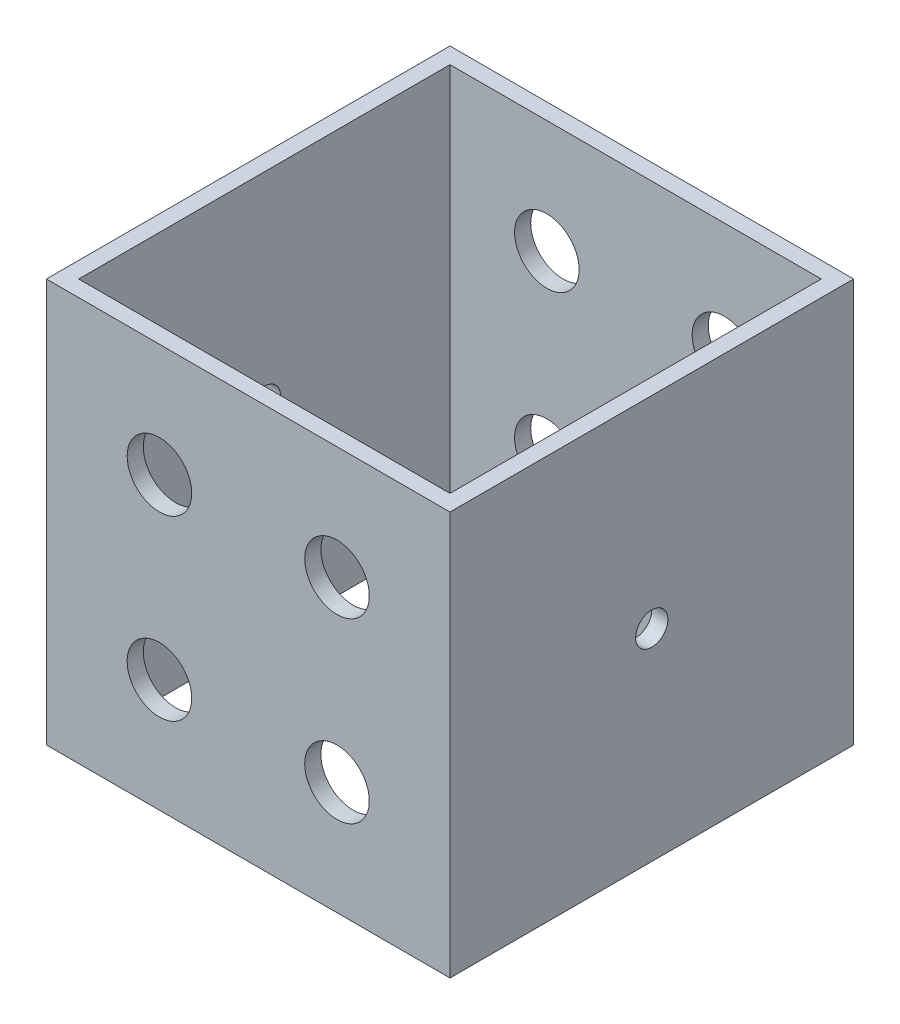
ISO-10303-21;
HEADER;
FILE_DESCRIPTION(('STEP AP214'),'2;1');
FILE_NAME('part.step','',(''),(''),'','','');
FILE_SCHEMA(('AUTOMOTIVE_DESIGN { 1 0 10303 214 1 1 1 1 }'));
ENDSEC;
DATA;
#1=APPLICATION_CONTEXT('core data for automotive mechanical design processes');
#2=APPLICATION_PROTOCOL_DEFINITION('international standard','automotive_design',2000,#1);
#3=PRODUCT_CONTEXT('',#1,'mechanical');
#4=PRODUCT('Part','Part','',(#3));
#5=PRODUCT_RELATED_PRODUCT_CATEGORY('part','',(#4));
#6=PRODUCT_DEFINITION_FORMATION('','',#4);
#7=PRODUCT_DEFINITION_CONTEXT('part definition',#1,'design');
#8=PRODUCT_DEFINITION('design','',#6,#7);
#9=PRODUCT_DEFINITION_SHAPE('','',#8);
#10=(LENGTH_UNIT() NAMED_UNIT(*) SI_UNIT(.MILLI.,.METRE.));
#11=(NAMED_UNIT(*) PLANE_ANGLE_UNIT() SI_UNIT($,.RADIAN.));
#12=(NAMED_UNIT(*) SI_UNIT($,.STERADIAN.) SOLID_ANGLE_UNIT());
#13=UNCERTAINTY_MEASURE_WITH_UNIT(LENGTH_MEASURE(1.E-05),#10,'distance_accuracy_value','');
#14=(GEOMETRIC_REPRESENTATION_CONTEXT(3) GLOBAL_UNCERTAINTY_ASSIGNED_CONTEXT((#13)) GLOBAL_UNIT_ASSIGNED_CONTEXT((#10,
#11,#12)) REPRESENTATION_CONTEXT('',''));
#15=CARTESIAN_POINT('',(0.,0.,0.));
#16=DIRECTION('',(0.,0.,1.));
#17=DIRECTION('',(1.,0.,0.));
#18=AXIS2_PLACEMENT_3D('',#15,#16,#17);
#19=CARTESIAN_POINT('',(12.5,-12.5,-12.5));
#20=DIRECTION('',(1.,0.,0.));
#21=DIRECTION('',(0.,0.,-1.));
#22=AXIS2_PLACEMENT_3D('',#19,#20,#21);
#23=PLANE('',#22);
#24=CARTESIAN_POINT('',(12.5,0.,0.));
#25=DIRECTION('',(1.,0.,0.));
#26=DIRECTION('',(0.,0.,-1.));
#27=AXIS2_PLACEMENT_3D('',#24,#25,#26);
#28=CIRCLE('',#27,1.);
#29=CARTESIAN_POINT('',(12.5,0.,-1.));
#30=VERTEX_POINT('',#29);
#31=EDGE_CURVE('E220',#30,#30,#28,.T.);
#32=ORIENTED_EDGE('',*,*,#31,.F.);
#33=EDGE_LOOP('',(#32));
#34=FACE_BOUND('',#33,.T.);
#35=DIRECTION('',(0.,1.,0.));
#36=VECTOR('',#35,1.);
#37=CARTESIAN_POINT('',(12.5,-12.5,-12.5));
#38=LINE('',#37,#36);
#39=CARTESIAN_POINT('',(12.5,-12.5,-12.5));
#40=VERTEX_POINT('',#39);
#41=CARTESIAN_POINT('',(12.5,12.5,-12.5));
#42=VERTEX_POINT('',#41);
#43=EDGE_CURVE('E162',#40,#42,#38,.T.);
#44=ORIENTED_EDGE('',*,*,#43,.T.);
#45=DIRECTION('',(0.,0.,-1.));
#46=VECTOR('',#45,1.);
#47=CARTESIAN_POINT('',(12.5,12.5,-12.5));
#48=LINE('',#47,#46);
#49=CARTESIAN_POINT('',(12.5,12.5,12.5));
#50=VERTEX_POINT('',#49);
#51=EDGE_CURVE('E130',#50,#42,#48,.T.);
#52=ORIENTED_EDGE('',*,*,#51,.F.);
#53=DIRECTION('',(0.,1.,0.));
#54=VECTOR('',#53,1.);
#55=CARTESIAN_POINT('',(12.5,-12.5,12.5));
#56=LINE('',#55,#54);
#57=CARTESIAN_POINT('',(12.5,-12.5,12.5));
#58=VERTEX_POINT('',#57);
#59=EDGE_CURVE('E11',#58,#50,#56,.T.);
#60=ORIENTED_EDGE('',*,*,#59,.F.);
#61=DIRECTION('',(0.,0.,-1.));
#62=VECTOR('',#61,1.);
#63=CARTESIAN_POINT('',(12.5,-12.5,-12.5));
#64=LINE('',#63,#62);
#65=EDGE_CURVE('E149',#58,#40,#64,.T.);
#66=ORIENTED_EDGE('',*,*,#65,.T.);
#67=EDGE_LOOP('',(#44,#52,#60,#66));
#68=FACE_BOUND('',#67,.T.);
#69=ADVANCED_FACE('F33',(#34,#68),#23,.T.);
#70=CARTESIAN_POINT('',(-12.5,-12.5,12.5));
#71=DIRECTION('',(0.,0.,1.));
#72=DIRECTION('',(1.,0.,0.));
#73=AXIS2_PLACEMENT_3D('',#70,#71,#72);
#74=PLANE('',#73);
#75=CARTESIAN_POINT('',(5.49999999999999,5.5,12.5));
#76=DIRECTION('',(0.,0.,-1.));
#77=DIRECTION('',(-1.,0.,0.));
#78=AXIS2_PLACEMENT_3D('',#75,#76,#77);
#79=CIRCLE('',#78,2.);
#80=CARTESIAN_POINT('',(3.49999999999999,5.5,12.5));
#81=VERTEX_POINT('',#80);
#82=EDGE_CURVE('E203',#81,#81,#79,.T.);
#83=ORIENTED_EDGE('',*,*,#82,.T.);
#84=EDGE_LOOP('',(#83));
#85=FACE_BOUND('',#84,.T.);
#86=CARTESIAN_POINT('',(5.49999999999999,-5.5,12.5));
#87=DIRECTION('',(0.,0.,-1.));
#88=DIRECTION('',(-1.,0.,0.));
#89=AXIS2_PLACEMENT_3D('',#86,#87,#88);
#90=CIRCLE('',#89,2.);
#91=CARTESIAN_POINT('',(3.49999999999999,-5.5,12.5));
#92=VERTEX_POINT('',#91);
#93=EDGE_CURVE('E210',#92,#92,#90,.T.);
#94=ORIENTED_EDGE('',*,*,#93,.T.);
#95=EDGE_LOOP('',(#94));
#96=FACE_BOUND('',#95,.T.);
#97=CARTESIAN_POINT('',(-5.50000000000001,-5.5,12.5));
#98=DIRECTION('',(0.,0.,-1.));
#99=DIRECTION('',(-1.,0.,0.));
#100=AXIS2_PLACEMENT_3D('',#97,#98,#99);
#101=CIRCLE('',#100,2.);
#102=CARTESIAN_POINT('',(-7.50000000000001,-5.5,12.5));
#103=VERTEX_POINT('',#102);
#104=EDGE_CURVE('E197',#103,#103,#101,.T.);
#105=ORIENTED_EDGE('',*,*,#104,.T.);
#106=EDGE_LOOP('',(#105));
#107=FACE_BOUND('',#106,.T.);
#108=CARTESIAN_POINT('',(-5.50000000000001,5.5,12.5));
#109=DIRECTION('',(0.,0.,-1.));
#110=DIRECTION('',(-1.,0.,0.));
#111=AXIS2_PLACEMENT_3D('',#108,#109,#110);
#112=CIRCLE('',#111,2.);
#113=CARTESIAN_POINT('',(-7.50000000000001,5.5,12.5));
#114=VERTEX_POINT('',#113);
#115=EDGE_CURVE('E172',#114,#114,#112,.T.);
#116=ORIENTED_EDGE('',*,*,#115,.T.);
#117=EDGE_LOOP('',(#116));
#118=FACE_BOUND('',#117,.T.);
#119=ORIENTED_EDGE('',*,*,#59,.T.);
#120=DIRECTION('',(1.,0.,0.));
#121=VECTOR('',#120,1.);
#122=CARTESIAN_POINT('',(-12.5,12.5,12.5));
#123=LINE('',#122,#121);
#124=CARTESIAN_POINT('',(-12.5,12.5,12.5));
#125=VERTEX_POINT('',#124);
#126=EDGE_CURVE('E139',#125,#50,#123,.T.);
#127=ORIENTED_EDGE('',*,*,#126,.F.);
#128=DIRECTION('',(0.,1.,0.));
#129=VECTOR('',#128,1.);
#130=CARTESIAN_POINT('',(-12.5,-12.5,12.5));
#131=LINE('',#130,#129);
#132=CARTESIAN_POINT('',(-12.5,-12.5,12.5));
#133=VERTEX_POINT('',#132);
#134=EDGE_CURVE('E41',#133,#125,#131,.T.);
#135=ORIENTED_EDGE('',*,*,#134,.F.);
#136=DIRECTION('',(1.,0.,0.));
#137=VECTOR('',#136,1.);
#138=CARTESIAN_POINT('',(-12.5,-12.5,12.5));
#139=LINE('',#138,#137);
#140=EDGE_CURVE('E160',#133,#58,#139,.T.);
#141=ORIENTED_EDGE('',*,*,#140,.T.);
#142=EDGE_LOOP('',(#119,#127,#135,#141));
#143=FACE_BOUND('',#142,.T.);
#144=ADVANCED_FACE('F249',(#85,#96,#107,#118,#143),#74,.T.);
#145=CARTESIAN_POINT('',(-12.5,-12.5,-12.5));
#146=DIRECTION('',(-1.,0.,0.));
#147=DIRECTION('',(0.,0.,1.));
#148=AXIS2_PLACEMENT_3D('',#145,#146,#147);
#149=PLANE('',#148);
#150=CARTESIAN_POINT('',(-12.5,0.,0.));
#151=DIRECTION('',(1.,0.,0.));
#152=DIRECTION('',(0.,0.,-1.));
#153=AXIS2_PLACEMENT_3D('',#150,#151,#152);
#154=CIRCLE('',#153,1.);
#155=CARTESIAN_POINT('',(-12.5,0.,-0.999999999999998));
#156=VERTEX_POINT('',#155);
#157=EDGE_CURVE('E223',#156,#156,#154,.T.);
#158=ORIENTED_EDGE('',*,*,#157,.T.);
#159=EDGE_LOOP('',(#158));
#160=FACE_BOUND('',#159,.T.);
#161=ORIENTED_EDGE('',*,*,#134,.T.);
#162=DIRECTION('',(0.,0.,1.));
#163=VECTOR('',#162,1.);
#164=CARTESIAN_POINT('',(-12.5,12.5,-12.5));
#165=LINE('',#164,#163);
#166=CARTESIAN_POINT('',(-12.5,12.5,-12.5));
#167=VERTEX_POINT('',#166);
#168=EDGE_CURVE('E136',#167,#125,#165,.T.);
#169=ORIENTED_EDGE('',*,*,#168,.F.);
#170=DIRECTION('',(0.,1.,0.));
#171=VECTOR('',#170,1.);
#172=CARTESIAN_POINT('',(-12.5,-12.5,-12.5));
#173=LINE('',#172,#171);
#174=CARTESIAN_POINT('',(-12.5,-12.5,-12.5));
#175=VERTEX_POINT('',#174);
#176=EDGE_CURVE('E165',#175,#167,#173,.T.);
#177=ORIENTED_EDGE('',*,*,#176,.F.);
#178=DIRECTION('',(0.,0.,1.));
#179=VECTOR('',#178,1.);
#180=CARTESIAN_POINT('',(-12.5,-12.5,-12.5));
#181=LINE('',#180,#179);
#182=EDGE_CURVE('E157',#175,#133,#181,.T.);
#183=ORIENTED_EDGE('',*,*,#182,.T.);
#184=EDGE_LOOP('',(#161,#169,#177,#183));
#185=FACE_BOUND('',#184,.T.);
#186=ADVANCED_FACE('F254',(#160,#185),#149,.T.);
#187=CARTESIAN_POINT('',(-12.5,-12.5,-12.5));
#188=DIRECTION('',(0.,0.,-1.));
#189=DIRECTION('',(-1.,0.,0.));
#190=AXIS2_PLACEMENT_3D('',#187,#188,#189);
#191=PLANE('',#190);
#192=CARTESIAN_POINT('',(5.49999999999999,5.5,-12.5));
#193=DIRECTION('',(0.,0.,-1.));
#194=DIRECTION('',(-1.,0.,0.));
#195=AXIS2_PLACEMENT_3D('',#192,#193,#194);
#196=CIRCLE('',#195,2.);
#197=CARTESIAN_POINT('',(3.49999999999999,5.5,-12.5));
#198=VERTEX_POINT('',#197);
#199=EDGE_CURVE('E200',#198,#198,#196,.T.);
#200=ORIENTED_EDGE('',*,*,#199,.F.);
#201=EDGE_LOOP('',(#200));
#202=FACE_BOUND('',#201,.T.);
#203=CARTESIAN_POINT('',(5.49999999999999,-5.5,-12.5));
#204=DIRECTION('',(0.,0.,-1.));
#205=DIRECTION('',(-1.,0.,0.));
#206=AXIS2_PLACEMENT_3D('',#203,#204,#205);
#207=CIRCLE('',#206,2.);
#208=CARTESIAN_POINT('',(3.49999999999999,-5.5,-12.5));
#209=VERTEX_POINT('',#208);
#210=EDGE_CURVE('E207',#209,#209,#207,.T.);
#211=ORIENTED_EDGE('',*,*,#210,.F.);
#212=EDGE_LOOP('',(#211));
#213=FACE_BOUND('',#212,.T.);
#214=CARTESIAN_POINT('',(-5.50000000000001,-5.5,-12.5));
#215=DIRECTION('',(0.,0.,-1.));
#216=DIRECTION('',(-1.,0.,0.));
#217=AXIS2_PLACEMENT_3D('',#214,#215,#216);
#218=CIRCLE('',#217,2.);
#219=CARTESIAN_POINT('',(-7.50000000000001,-5.5,-12.5));
#220=VERTEX_POINT('',#219);
#221=EDGE_CURVE('E213',#220,#220,#218,.T.);
#222=ORIENTED_EDGE('',*,*,#221,.F.);
#223=EDGE_LOOP('',(#222));
#224=FACE_BOUND('',#223,.T.);
#225=CARTESIAN_POINT('',(-5.50000000000001,5.5,-12.5));
#226=DIRECTION('',(0.,0.,-1.));
#227=DIRECTION('',(-1.,0.,0.));
#228=AXIS2_PLACEMENT_3D('',#225,#226,#227);
#229=CIRCLE('',#228,2.);
#230=CARTESIAN_POINT('',(-7.50000000000001,5.5,-12.5));
#231=VERTEX_POINT('',#230);
#232=EDGE_CURVE('E194',#231,#231,#229,.T.);
#233=ORIENTED_EDGE('',*,*,#232,.F.);
#234=EDGE_LOOP('',(#233));
#235=FACE_BOUND('',#234,.T.);
#236=ORIENTED_EDGE('',*,*,#176,.T.);
#237=DIRECTION('',(-1.,0.,0.));
#238=VECTOR('',#237,1.);
#239=CARTESIAN_POINT('',(-12.5,12.5,-12.5));
#240=LINE('',#239,#238);
#241=EDGE_CURVE('E133',#42,#167,#240,.T.);
#242=ORIENTED_EDGE('',*,*,#241,.F.);
#243=ORIENTED_EDGE('',*,*,#43,.F.);
#244=DIRECTION('',(-1.,0.,0.));
#245=VECTOR('',#244,1.);
#246=CARTESIAN_POINT('',(-12.5,-12.5,-12.5));
#247=LINE('',#246,#245);
#248=EDGE_CURVE('E154',#40,#175,#247,.T.);
#249=ORIENTED_EDGE('',*,*,#248,.T.);
#250=EDGE_LOOP('',(#236,#242,#243,#249));
#251=FACE_BOUND('',#250,.T.);
#252=ADVANCED_FACE('F261',(#202,#213,#224,#235,#251),#191,.T.);
#253=CARTESIAN_POINT('',(0.,-12.5,0.));
#254=DIRECTION('',(0.,1.,0.));
#255=DIRECTION('',(0.,0.,1.));
#256=AXIS2_PLACEMENT_3D('',#253,#254,#255);
#257=PLANE('',#256);
#258=DIRECTION('',(1.,0.,0.));
#259=VECTOR('',#258,1.);
#260=CARTESIAN_POINT('',(-11.5,-12.5,11.5));
#261=LINE('',#260,#259);
#262=CARTESIAN_POINT('',(-11.5,-12.5,11.5));
#263=VERTEX_POINT('',#262);
#264=CARTESIAN_POINT('',(11.5,-12.5,11.5));
#265=VERTEX_POINT('',#264);
#266=EDGE_CURVE('E110',#263,#265,#261,.T.);
#267=ORIENTED_EDGE('',*,*,#266,.T.);
#268=DIRECTION('',(0.,0.,-1.));
#269=VECTOR('',#268,1.);
#270=CARTESIAN_POINT('',(11.5,-12.5,-11.5));
#271=LINE('',#270,#269);
#272=CARTESIAN_POINT('',(11.5,-12.5,-11.5));
#273=VERTEX_POINT('',#272);
#274=EDGE_CURVE('E142',#265,#273,#271,.T.);
#275=ORIENTED_EDGE('',*,*,#274,.T.);
#276=DIRECTION('',(-1.,0.,0.));
#277=VECTOR('',#276,1.);
#278=CARTESIAN_POINT('',(-11.5,-12.5,-11.5));
#279=LINE('',#278,#277);
#280=CARTESIAN_POINT('',(-11.5,-12.5,-11.5));
#281=VERTEX_POINT('',#280);
#282=EDGE_CURVE('E105',#273,#281,#279,.T.);
#283=ORIENTED_EDGE('',*,*,#282,.T.);
#284=DIRECTION('',(0.,0.,1.));
#285=VECTOR('',#284,1.);
#286=CARTESIAN_POINT('',(-11.5,-12.5,-11.5));
#287=LINE('',#286,#285);
#288=EDGE_CURVE('E49',#281,#263,#287,.T.);
#289=ORIENTED_EDGE('',*,*,#288,.T.);
#290=EDGE_LOOP('',(#267,#275,#283,#289));
#291=FACE_BOUND('',#290,.T.);
#292=ORIENTED_EDGE('',*,*,#65,.F.);
#293=ORIENTED_EDGE('',*,*,#140,.F.);
#294=ORIENTED_EDGE('',*,*,#182,.F.);
#295=ORIENTED_EDGE('',*,*,#248,.F.);
#296=EDGE_LOOP('',(#292,#293,#294,#295));
#297=FACE_BOUND('',#296,.T.);
#298=ADVANCED_FACE('F269',(#291,#297),#257,.F.);
#299=CARTESIAN_POINT('',(11.5,-12.5,-11.5));
#300=DIRECTION('',(1.,0.,0.));
#301=DIRECTION('',(0.,0.,-1.));
#302=AXIS2_PLACEMENT_3D('',#299,#300,#301);
#303=PLANE('',#302);
#304=CARTESIAN_POINT('',(11.5,0.,0.));
#305=DIRECTION('',(1.,0.,0.));
#306=DIRECTION('',(0.,0.,-1.));
#307=AXIS2_PLACEMENT_3D('',#304,#305,#306);
#308=CIRCLE('',#307,1.);
#309=CARTESIAN_POINT('',(11.5,0.,-1.));
#310=VERTEX_POINT('',#309);
#311=EDGE_CURVE('E204',#310,#310,#308,.T.);
#312=ORIENTED_EDGE('',*,*,#311,.T.);
#313=EDGE_LOOP('',(#312));
#314=FACE_BOUND('',#313,.T.);
#315=DIRECTION('',(0.,1.,0.));
#316=VECTOR('',#315,1.);
#317=CARTESIAN_POINT('',(11.5,-12.5,11.5));
#318=LINE('',#317,#316);
#319=CARTESIAN_POINT('',(11.5,12.5,11.5));
#320=VERTEX_POINT('',#319);
#321=EDGE_CURVE('E115',#265,#320,#318,.T.);
#322=ORIENTED_EDGE('',*,*,#321,.T.);
#323=DIRECTION('',(0.,0.,-1.));
#324=VECTOR('',#323,1.);
#325=CARTESIAN_POINT('',(11.5,12.5,-11.5));
#326=LINE('',#325,#324);
#327=CARTESIAN_POINT('',(11.5,12.5,-11.5));
#328=VERTEX_POINT('',#327);
#329=EDGE_CURVE('E113',#320,#328,#326,.T.);
#330=ORIENTED_EDGE('',*,*,#329,.T.);
#331=DIRECTION('',(0.,1.,0.));
#332=VECTOR('',#331,1.);
#333=CARTESIAN_POINT('',(11.5,-12.5,-11.5));
#334=LINE('',#333,#332);
#335=EDGE_CURVE('E98',#273,#328,#334,.T.);
#336=ORIENTED_EDGE('',*,*,#335,.F.);
#337=ORIENTED_EDGE('',*,*,#274,.F.);
#338=EDGE_LOOP('',(#322,#330,#336,#337));
#339=FACE_BOUND('',#338,.T.);
#340=ADVANCED_FACE('F114',(#314,#339),#303,.F.);
#341=CARTESIAN_POINT('',(-11.5,-12.5,11.5));
#342=DIRECTION('',(0.,0.,1.));
#343=DIRECTION('',(1.,0.,0.));
#344=AXIS2_PLACEMENT_3D('',#341,#342,#343);
#345=PLANE('',#344);
#346=CARTESIAN_POINT('',(5.49999999999999,5.5,11.5));
#347=DIRECTION('',(0.,0.,1.));
#348=DIRECTION('',(1.,0.,0.));
#349=AXIS2_PLACEMENT_3D('',#346,#347,#348);
#350=CIRCLE('',#349,2.);
#351=CARTESIAN_POINT('',(7.49999999999999,5.5,11.5));
#352=VERTEX_POINT('',#351);
#353=EDGE_CURVE('E119',#352,#352,#350,.T.);
#354=ORIENTED_EDGE('',*,*,#353,.T.);
#355=EDGE_LOOP('',(#354));
#356=FACE_BOUND('',#355,.T.);
#357=CARTESIAN_POINT('',(5.49999999999999,-5.5,11.5));
#358=DIRECTION('',(0.,0.,1.));
#359=DIRECTION('',(1.,0.,0.));
#360=AXIS2_PLACEMENT_3D('',#357,#358,#359);
#361=CIRCLE('',#360,2.);
#362=CARTESIAN_POINT('',(7.49999999999999,-5.5,11.5));
#363=VERTEX_POINT('',#362);
#364=EDGE_CURVE('E179',#363,#363,#361,.T.);
#365=ORIENTED_EDGE('',*,*,#364,.T.);
#366=EDGE_LOOP('',(#365));
#367=FACE_BOUND('',#366,.T.);
#368=CARTESIAN_POINT('',(-5.50000000000001,-5.5,11.5));
#369=DIRECTION('',(0.,0.,1.));
#370=DIRECTION('',(1.,0.,0.));
#371=AXIS2_PLACEMENT_3D('',#368,#369,#370);
#372=CIRCLE('',#371,2.);
#373=CARTESIAN_POINT('',(-3.50000000000001,-5.5,11.5));
#374=VERTEX_POINT('',#373);
#375=EDGE_CURVE('E176',#374,#374,#372,.T.);
#376=ORIENTED_EDGE('',*,*,#375,.T.);
#377=EDGE_LOOP('',(#376));
#378=FACE_BOUND('',#377,.T.);
#379=CARTESIAN_POINT('',(-5.50000000000001,5.5,11.5));
#380=DIRECTION('',(0.,0.,1.));
#381=DIRECTION('',(1.,0.,0.));
#382=AXIS2_PLACEMENT_3D('',#379,#380,#381);
#383=CIRCLE('',#382,2.);
#384=CARTESIAN_POINT('',(-3.50000000000001,5.5,11.5));
#385=VERTEX_POINT('',#384);
#386=EDGE_CURVE('E171',#385,#385,#383,.T.);
#387=ORIENTED_EDGE('',*,*,#386,.T.);
#388=EDGE_LOOP('',(#387));
#389=FACE_BOUND('',#388,.T.);
#390=DIRECTION('',(0.,1.,0.));
#391=VECTOR('',#390,1.);
#392=CARTESIAN_POINT('',(-11.5,-12.5,11.5));
#393=LINE('',#392,#391);
#394=CARTESIAN_POINT('',(-11.5,12.5,11.5));
#395=VERTEX_POINT('',#394);
#396=EDGE_CURVE('E150',#263,#395,#393,.T.);
#397=ORIENTED_EDGE('',*,*,#396,.T.);
#398=DIRECTION('',(1.,0.,0.));
#399=VECTOR('',#398,1.);
#400=CARTESIAN_POINT('',(-11.5,12.5,11.5));
#401=LINE('',#400,#399);
#402=EDGE_CURVE('E125',#395,#320,#401,.T.);
#403=ORIENTED_EDGE('',*,*,#402,.T.);
#404=ORIENTED_EDGE('',*,*,#321,.F.);
#405=ORIENTED_EDGE('',*,*,#266,.F.);
#406=EDGE_LOOP('',(#397,#403,#404,#405));
#407=FACE_BOUND('',#406,.T.);
#408=ADVANCED_FACE('F283',(#356,#367,#378,#389,#407),#345,.F.);
#409=CARTESIAN_POINT('',(-11.5,-12.5,-11.5));
#410=DIRECTION('',(-1.,0.,0.));
#411=DIRECTION('',(0.,0.,1.));
#412=AXIS2_PLACEMENT_3D('',#409,#410,#411);
#413=PLANE('',#412);
#414=CARTESIAN_POINT('',(-11.5,0.,0.));
#415=DIRECTION('',(-1.,0.,0.));
#416=DIRECTION('',(0.,0.,1.));
#417=AXIS2_PLACEMENT_3D('',#414,#415,#416);
#418=CIRCLE('',#417,1.);
#419=CARTESIAN_POINT('',(-11.5,0.,1.));
#420=VERTEX_POINT('',#419);
#421=EDGE_CURVE('E36',#420,#420,#418,.T.);
#422=ORIENTED_EDGE('',*,*,#421,.T.);
#423=EDGE_LOOP('',(#422));
#424=FACE_BOUND('',#423,.T.);
#425=DIRECTION('',(0.,1.,0.));
#426=VECTOR('',#425,1.);
#427=CARTESIAN_POINT('',(-11.5,-12.5,-11.5));
#428=LINE('',#427,#426);
#429=CARTESIAN_POINT('',(-11.5,12.5,-11.5));
#430=VERTEX_POINT('',#429);
#431=EDGE_CURVE('E109',#281,#430,#428,.T.);
#432=ORIENTED_EDGE('',*,*,#431,.T.);
#433=DIRECTION('',(0.,0.,1.));
#434=VECTOR('',#433,1.);
#435=CARTESIAN_POINT('',(-11.5,12.5,-11.5));
#436=LINE('',#435,#434);
#437=EDGE_CURVE('E123',#430,#395,#436,.T.);
#438=ORIENTED_EDGE('',*,*,#437,.T.);
#439=ORIENTED_EDGE('',*,*,#396,.F.);
#440=ORIENTED_EDGE('',*,*,#288,.F.);
#441=EDGE_LOOP('',(#432,#438,#439,#440));
#442=FACE_BOUND('',#441,.T.);
#443=ADVANCED_FACE('F230',(#424,#442),#413,.F.);
#444=CARTESIAN_POINT('',(-11.5,-12.5,-11.5));
#445=DIRECTION('',(0.,0.,-1.));
#446=DIRECTION('',(-1.,0.,0.));
#447=AXIS2_PLACEMENT_3D('',#444,#445,#446);
#448=PLANE('',#447);
#449=CARTESIAN_POINT('',(5.49999999999999,5.5,-11.5));
#450=DIRECTION('',(0.,0.,-1.));
#451=DIRECTION('',(-1.,0.,0.));
#452=AXIS2_PLACEMENT_3D('',#449,#450,#451);
#453=CIRCLE('',#452,2.);
#454=CARTESIAN_POINT('',(3.49999999999999,5.5,-11.5));
#455=VERTEX_POINT('',#454);
#456=EDGE_CURVE('E180',#455,#455,#453,.T.);
#457=ORIENTED_EDGE('',*,*,#456,.T.);
#458=EDGE_LOOP('',(#457));
#459=FACE_BOUND('',#458,.T.);
#460=CARTESIAN_POINT('',(5.49999999999999,-5.5,-11.5));
#461=DIRECTION('',(0.,0.,-1.));
#462=DIRECTION('',(-1.,0.,0.));
#463=AXIS2_PLACEMENT_3D('',#460,#461,#462);
#464=CIRCLE('',#463,2.);
#465=CARTESIAN_POINT('',(3.49999999999999,-5.5,-11.5));
#466=VERTEX_POINT('',#465);
#467=EDGE_CURVE('E177',#466,#466,#464,.T.);
#468=ORIENTED_EDGE('',*,*,#467,.T.);
#469=EDGE_LOOP('',(#468));
#470=FACE_BOUND('',#469,.T.);
#471=CARTESIAN_POINT('',(-5.50000000000001,-5.5,-11.5));
#472=DIRECTION('',(0.,0.,-1.));
#473=DIRECTION('',(-1.,0.,0.));
#474=AXIS2_PLACEMENT_3D('',#471,#472,#473);
#475=CIRCLE('',#474,2.);
#476=CARTESIAN_POINT('',(-7.50000000000001,-5.5,-11.5));
#477=VERTEX_POINT('',#476);
#478=EDGE_CURVE('E173',#477,#477,#475,.T.);
#479=ORIENTED_EDGE('',*,*,#478,.T.);
#480=EDGE_LOOP('',(#479));
#481=FACE_BOUND('',#480,.T.);
#482=CARTESIAN_POINT('',(-5.50000000000001,5.5,-11.5));
#483=DIRECTION('',(0.,0.,-1.));
#484=DIRECTION('',(-1.,0.,0.));
#485=AXIS2_PLACEMENT_3D('',#482,#483,#484);
#486=CIRCLE('',#485,2.);
#487=CARTESIAN_POINT('',(-7.50000000000001,5.5,-11.5));
#488=VERTEX_POINT('',#487);
#489=EDGE_CURVE('E168',#488,#488,#486,.T.);
#490=ORIENTED_EDGE('',*,*,#489,.T.);
#491=EDGE_LOOP('',(#490));
#492=FACE_BOUND('',#491,.T.);
#493=ORIENTED_EDGE('',*,*,#335,.T.);
#494=DIRECTION('',(-1.,0.,0.));
#495=VECTOR('',#494,1.);
#496=CARTESIAN_POINT('',(-11.5,12.5,-11.5));
#497=LINE('',#496,#495);
#498=EDGE_CURVE('E102',#328,#430,#497,.T.);
#499=ORIENTED_EDGE('',*,*,#498,.T.);
#500=ORIENTED_EDGE('',*,*,#431,.F.);
#501=ORIENTED_EDGE('',*,*,#282,.F.);
#502=EDGE_LOOP('',(#493,#499,#500,#501));
#503=FACE_BOUND('',#502,.T.);
#504=ADVANCED_FACE('F100',(#459,#470,#481,#492,#503),#448,.F.);
#505=CARTESIAN_POINT('',(0.,12.5,0.));
#506=DIRECTION('',(0.,1.,0.));
#507=DIRECTION('',(0.,0.,1.));
#508=AXIS2_PLACEMENT_3D('',#505,#506,#507);
#509=PLANE('',#508);
#510=ORIENTED_EDGE('',*,*,#51,.T.);
#511=ORIENTED_EDGE('',*,*,#241,.T.);
#512=ORIENTED_EDGE('',*,*,#168,.T.);
#513=ORIENTED_EDGE('',*,*,#126,.T.);
#514=EDGE_LOOP('',(#510,#511,#512,#513));
#515=FACE_BOUND('',#514,.T.);
#516=ORIENTED_EDGE('',*,*,#498,.F.);
#517=ORIENTED_EDGE('',*,*,#329,.F.);
#518=ORIENTED_EDGE('',*,*,#402,.F.);
#519=ORIENTED_EDGE('',*,*,#437,.F.);
#520=EDGE_LOOP('',(#516,#517,#518,#519));
#521=FACE_BOUND('',#520,.T.);
#522=ADVANCED_FACE('F121',(#515,#521),#509,.T.);
#523=CARTESIAN_POINT('',(-5.50000000000001,5.5,12.5));
#524=DIRECTION('',(0.,0.,-1.));
#525=DIRECTION('',(-1.,0.,0.));
#526=AXIS2_PLACEMENT_3D('',#523,#524,#525);
#527=CYLINDRICAL_SURFACE('',#526,2.);
#528=ORIENTED_EDGE('',*,*,#232,.T.);
#529=EDGE_LOOP('',(#528));
#530=FACE_BOUND('',#529,.T.);
#531=ORIENTED_EDGE('',*,*,#489,.F.);
#532=EDGE_LOOP('',(#531));
#533=FACE_BOUND('',#532,.T.);
#534=ADVANCED_FACE('F294',(#530,#533),#527,.F.);
#535=CARTESIAN_POINT('',(-5.50000000000001,-5.5,12.5));
#536=DIRECTION('',(0.,0.,-1.));
#537=DIRECTION('',(-1.,0.,0.));
#538=AXIS2_PLACEMENT_3D('',#535,#536,#537);
#539=CYLINDRICAL_SURFACE('',#538,2.);
#540=ORIENTED_EDGE('',*,*,#221,.T.);
#541=EDGE_LOOP('',(#540));
#542=FACE_BOUND('',#541,.T.);
#543=ORIENTED_EDGE('',*,*,#478,.F.);
#544=EDGE_LOOP('',(#543));
#545=FACE_BOUND('',#544,.T.);
#546=ADVANCED_FACE('F305',(#542,#545),#539,.F.);
#547=CARTESIAN_POINT('',(5.49999999999999,-5.5,12.5));
#548=DIRECTION('',(0.,0.,-1.));
#549=DIRECTION('',(-1.,0.,0.));
#550=AXIS2_PLACEMENT_3D('',#547,#548,#549);
#551=CYLINDRICAL_SURFACE('',#550,2.);
#552=ORIENTED_EDGE('',*,*,#210,.T.);
#553=EDGE_LOOP('',(#552));
#554=FACE_BOUND('',#553,.T.);
#555=ORIENTED_EDGE('',*,*,#467,.F.);
#556=EDGE_LOOP('',(#555));
#557=FACE_BOUND('',#556,.T.);
#558=ADVANCED_FACE('F302',(#554,#557),#551,.F.);
#559=CARTESIAN_POINT('',(5.49999999999999,5.5,12.5));
#560=DIRECTION('',(0.,0.,-1.));
#561=DIRECTION('',(-1.,0.,0.));
#562=AXIS2_PLACEMENT_3D('',#559,#560,#561);
#563=CYLINDRICAL_SURFACE('',#562,2.);
#564=ORIENTED_EDGE('',*,*,#199,.T.);
#565=EDGE_LOOP('',(#564));
#566=FACE_BOUND('',#565,.T.);
#567=ORIENTED_EDGE('',*,*,#456,.F.);
#568=EDGE_LOOP('',(#567));
#569=FACE_BOUND('',#568,.T.);
#570=ADVANCED_FACE('F246',(#566,#569),#563,.F.);
#571=ORIENTED_EDGE('',*,*,#115,.F.);
#572=EDGE_LOOP('',(#571));
#573=FACE_BOUND('',#572,.T.);
#574=ORIENTED_EDGE('',*,*,#386,.F.);
#575=EDGE_LOOP('',(#574));
#576=FACE_BOUND('',#575,.T.);
#577=ADVANCED_FACE('F295',(#573,#576),#527,.F.);
#578=ORIENTED_EDGE('',*,*,#104,.F.);
#579=EDGE_LOOP('',(#578));
#580=FACE_BOUND('',#579,.T.);
#581=ORIENTED_EDGE('',*,*,#375,.F.);
#582=EDGE_LOOP('',(#581));
#583=FACE_BOUND('',#582,.T.);
#584=ADVANCED_FACE('F297',(#580,#583),#539,.F.);
#585=ORIENTED_EDGE('',*,*,#93,.F.);
#586=EDGE_LOOP('',(#585));
#587=FACE_BOUND('',#586,.T.);
#588=ORIENTED_EDGE('',*,*,#364,.F.);
#589=EDGE_LOOP('',(#588));
#590=FACE_BOUND('',#589,.T.);
#591=ADVANCED_FACE('F243',(#587,#590),#551,.F.);
#592=ORIENTED_EDGE('',*,*,#82,.F.);
#593=EDGE_LOOP('',(#592));
#594=FACE_BOUND('',#593,.T.);
#595=ORIENTED_EDGE('',*,*,#353,.F.);
#596=EDGE_LOOP('',(#595));
#597=FACE_BOUND('',#596,.T.);
#598=ADVANCED_FACE('F235',(#594,#597),#563,.F.);
#599=CARTESIAN_POINT('',(-12.5,0.,0.));
#600=DIRECTION('',(1.,0.,0.));
#601=DIRECTION('',(0.,0.,-1.));
#602=AXIS2_PLACEMENT_3D('',#599,#600,#601);
#603=CYLINDRICAL_SURFACE('',#602,1.);
#604=ORIENTED_EDGE('',*,*,#157,.F.);
#605=EDGE_LOOP('',(#604));
#606=FACE_BOUND('',#605,.T.);
#607=ORIENTED_EDGE('',*,*,#421,.F.);
#608=EDGE_LOOP('',(#607));
#609=FACE_BOUND('',#608,.T.);
#610=ADVANCED_FACE('F232',(#606,#609),#603,.F.);
#611=ORIENTED_EDGE('',*,*,#31,.T.);
#612=EDGE_LOOP('',(#611));
#613=FACE_BOUND('',#612,.T.);
#614=ORIENTED_EDGE('',*,*,#311,.F.);
#615=EDGE_LOOP('',(#614));
#616=FACE_BOUND('',#615,.T.);
#617=ADVANCED_FACE('F234',(#613,#616),#603,.F.);
#618=CLOSED_SHELL('',(#69,#144,#186,#252,#298,#340,#408,#443,#504,#522,#534,#546,#558,#570,#577,
#584,#591,#598,#610,#617));
#619=MANIFOLD_SOLID_BREP('B2',#618);
#620=ADVANCED_BREP_SHAPE_REPRESENTATION('',(#18,#619),#14);
#621=SHAPE_DEFINITION_REPRESENTATION(#9,#620);
ENDSEC;
END-ISO-10303-21;
